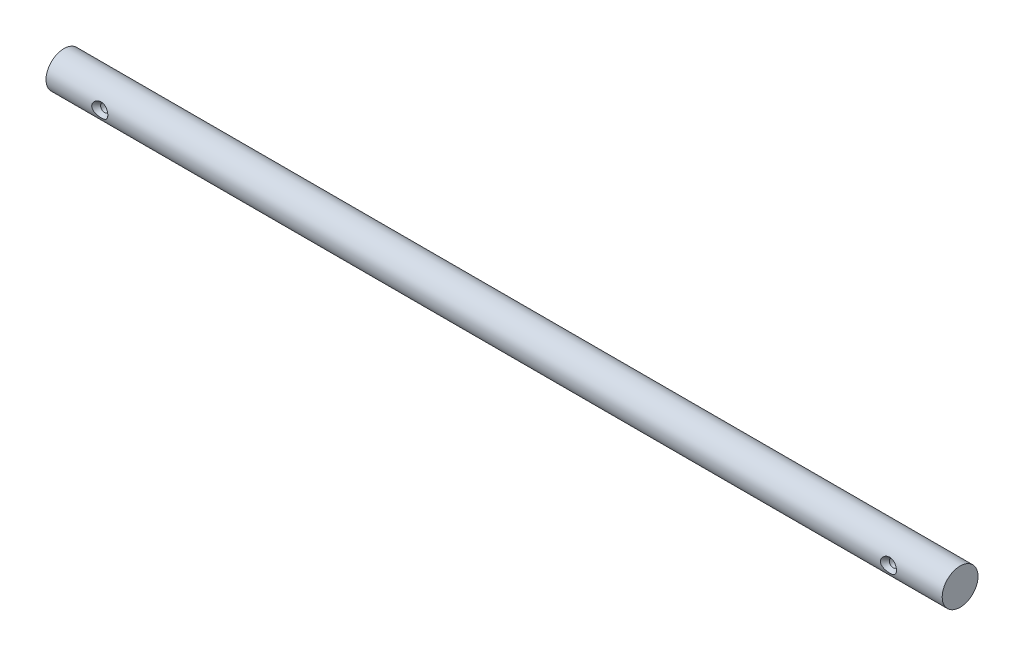
ISO-10303-21;
HEADER;
FILE_DESCRIPTION(('STEP AP214'),'2;1');
FILE_NAME('part.step','',(''),(''),'','','');
FILE_SCHEMA(('AUTOMOTIVE_DESIGN { 1 0 10303 214 1 1 1 1 }'));
ENDSEC;
DATA;
#1=APPLICATION_CONTEXT('core data for automotive mechanical design processes');
#2=APPLICATION_PROTOCOL_DEFINITION('international standard','automotive_design',2000,#1);
#3=PRODUCT_CONTEXT('',#1,'mechanical');
#4=PRODUCT('Part','Part','',(#3));
#5=PRODUCT_RELATED_PRODUCT_CATEGORY('part','',(#4));
#6=PRODUCT_DEFINITION_FORMATION('','',#4);
#7=PRODUCT_DEFINITION_CONTEXT('part definition',#1,'design');
#8=PRODUCT_DEFINITION('design','',#6,#7);
#9=PRODUCT_DEFINITION_SHAPE('','',#8);
#10=(LENGTH_UNIT() NAMED_UNIT(*) SI_UNIT(.MILLI.,.METRE.));
#11=(NAMED_UNIT(*) PLANE_ANGLE_UNIT() SI_UNIT($,.RADIAN.));
#12=(NAMED_UNIT(*) SI_UNIT($,.STERADIAN.) SOLID_ANGLE_UNIT());
#13=UNCERTAINTY_MEASURE_WITH_UNIT(LENGTH_MEASURE(1.E-05),#10,'distance_accuracy_value','');
#14=(GEOMETRIC_REPRESENTATION_CONTEXT(3) GLOBAL_UNCERTAINTY_ASSIGNED_CONTEXT((#13)) GLOBAL_UNIT_ASSIGNED_CONTEXT((#10,
#11,#12)) REPRESENTATION_CONTEXT('',''));
#15=CARTESIAN_POINT('',(0.,0.,0.));
#16=DIRECTION('',(0.,0.,1.));
#17=DIRECTION('',(1.,0.,0.));
#18=AXIS2_PLACEMENT_3D('',#15,#16,#17);
#19=CARTESIAN_POINT('',(0.,6.35,0.));
#20=DIRECTION('',(1.,0.,0.));
#21=DIRECTION('',(0.,0.,-1.));
#22=AXIS2_PLACEMENT_3D('',#19,#20,#21);
#23=PLANE('',#22);
#24=CARTESIAN_POINT('',(0.,0.,0.));
#25=DIRECTION('',(-1.,0.,0.));
#26=DIRECTION('',(0.,0.,1.));
#27=AXIS2_PLACEMENT_3D('',#24,#25,#26);
#28=CIRCLE('',#27,6.35);
#29=CARTESIAN_POINT('',(0.,0.,6.35));
#30=VERTEX_POINT('',#29);
#31=EDGE_CURVE('E97',#30,#30,#28,.T.);
#32=ORIENTED_EDGE('',*,*,#31,.T.);
#33=EDGE_LOOP('',(#32));
#34=FACE_BOUND('',#33,.T.);
#35=ADVANCED_FACE('F42',(#34),#23,.F.);
#36=CARTESIAN_POINT('',(317.5,0.,0.));
#37=DIRECTION('',(-1.,0.,0.));
#38=DIRECTION('',(0.,0.,1.));
#39=AXIS2_PLACEMENT_3D('',#36,#37,#38);
#40=PLANE('',#39);
#41=CARTESIAN_POINT('',(317.5,0.,0.));
#42=DIRECTION('',(-1.,0.,0.));
#43=DIRECTION('',(0.,0.,1.));
#44=AXIS2_PLACEMENT_3D('',#41,#42,#43);
#45=CIRCLE('',#44,6.35);
#46=CARTESIAN_POINT('',(317.5,0.,6.35));
#47=VERTEX_POINT('',#46);
#48=EDGE_CURVE('E94',#47,#47,#45,.T.);
#49=ORIENTED_EDGE('',*,*,#48,.F.);
#50=EDGE_LOOP('',(#49));
#51=FACE_BOUND('',#50,.T.);
#52=ADVANCED_FACE('F116',(#51),#40,.F.);
#53=CARTESIAN_POINT('',(0.,0.,0.));
#54=DIRECTION('',(-1.,0.,0.));
#55=DIRECTION('',(0.,0.,1.));
#56=AXIS2_PLACEMENT_3D('',#53,#54,#55);
#57=CYLINDRICAL_SURFACE('',#56,6.35);
#58=CARTESIAN_POINT('',(20.4390625,0.,-6.35));
#59=CARTESIAN_POINT('',(20.4390598693034,0.077040847168283,-6.34999857899858));
#60=CARTESIAN_POINT('',(20.4326315480876,0.154113483155262,-6.34858371582944));
#61=CARTESIAN_POINT('',(20.4071148143666,0.306069518531248,-6.3430762080525));
#62=CARTESIAN_POINT('',(20.3880173565476,0.380951313826296,-6.33898165026606));
#63=CARTESIAN_POINT('',(20.3377891374239,0.526307623730004,-6.32857064766496));
#64=CARTESIAN_POINT('',(20.3066709469655,0.596786653438424,-6.32225652460999));
#65=CARTESIAN_POINT('',(20.2333244870091,0.73152084022531,-6.30808785716228));
#66=CARTESIAN_POINT('',(20.1910965046489,0.795776158099904,-6.30023335258277));
#67=CARTESIAN_POINT('',(20.0960119171915,0.917272723348733,-6.28370341003478));
#68=CARTESIAN_POINT('',(20.043011163738,0.974399782936219,-6.27501778865132));
#69=CARTESIAN_POINT('',(19.9281949885077,1.07902809540525,-6.25787628862363));
#70=CARTESIAN_POINT('',(19.8663787814889,1.12652848987194,-6.24942043052567));
#71=CARTESIAN_POINT('',(19.7348421298178,1.21105894182183,-6.23359544573771));
#72=CARTESIAN_POINT('',(19.6650418522263,1.24796743339354,-6.22623936751426));
#73=CARTESIAN_POINT('',(19.5200422066535,1.30948659380819,-6.21359298291537));
#74=CARTESIAN_POINT('',(19.44484348561,1.33409873341495,-6.20830242949951));
#75=CARTESIAN_POINT('',(19.292420223313,1.36994915689751,-6.20048981569181));
#76=CARTESIAN_POINT('',(19.2152454219172,1.38138961213298,-6.19792595162784));
#77=CARTESIAN_POINT('',(19.0600325548733,1.39120053912365,-6.19573145355588));
#78=CARTESIAN_POINT('',(18.9819945965354,1.3895726177385,-6.19610045892848));
#79=CARTESIAN_POINT('',(18.8287736715116,1.37345569747506,-6.19969216119694));
#80=CARTESIAN_POINT('',(18.7535645930165,1.35920156493734,-6.20286274198083));
#81=CARTESIAN_POINT('',(18.6066317978724,1.31860894659745,-6.21161795094662));
#82=CARTESIAN_POINT('',(18.5349082770534,1.29226978268468,-6.21720271459119));
#83=CARTESIAN_POINT('',(18.3963223209075,1.22803912268215,-6.23020838169099));
#84=CARTESIAN_POINT('',(18.3295031345282,1.19005732002183,-6.23764354992541));
#85=CARTESIAN_POINT('',(18.2030997711631,1.10368304558917,-6.25350352055306));
#86=CARTESIAN_POINT('',(18.1435165823363,1.05528915442124,-6.26192845780233));
#87=CARTESIAN_POINT('',(18.0319243751887,0.948221191319585,-6.27904229219529));
#88=CARTESIAN_POINT('',(17.9801070541177,0.889347407317588,-6.28773295721028));
#89=CARTESIAN_POINT('',(17.887050075938,0.763647218737208,-6.30423308338503));
#90=CARTESIAN_POINT('',(17.8458106105133,0.696820670076994,-6.31204252857457));
#91=CARTESIAN_POINT('',(17.7750325873793,0.556877893735649,-6.32592565886695));
#92=CARTESIAN_POINT('',(17.7455191538667,0.483748565062285,-6.33199560926044));
#93=CARTESIAN_POINT('',(17.6992527118445,0.333406298546855,-6.3416880672381));
#94=CARTESIAN_POINT('',(17.6824978473559,0.256193956405845,-6.34531093078939));
#95=CARTESIAN_POINT('',(17.6625029862832,0.101521759768156,-6.34965034804132));
#96=CARTESIAN_POINT('',(17.6590011288717,0.0240972914376614,-6.35042320588568));
#97=CARTESIAN_POINT('',(17.6649019189039,-0.130230356866131,-6.34913331284916));
#98=CARTESIAN_POINT('',(17.6743036908942,-0.207133571848407,-6.34707075433855));
#99=CARTESIAN_POINT('',(17.7055277277516,-0.357368057618586,-6.34037731419124));
#100=CARTESIAN_POINT('',(17.7272126419359,-0.430729253025147,-6.33577484832666));
#101=CARTESIAN_POINT('',(17.7822349508315,-0.57277298475952,-6.32451674628277));
#102=CARTESIAN_POINT('',(17.8155733384149,-0.641455121837125,-6.31786093516479));
#103=CARTESIAN_POINT('',(17.8935018158413,-0.773273856447653,-6.30309556357787));
#104=CARTESIAN_POINT('',(17.9382457334331,-0.836317293289699,-6.29496660673028));
#105=CARTESIAN_POINT('',(18.0375125908739,-0.954094899266629,-6.27819624848666));
#106=CARTESIAN_POINT('',(18.0920368010628,-1.00882798728205,-6.26955478061946));
#107=CARTESIAN_POINT('',(18.2105181122511,-1.10946652714324,-6.2525388718201));
#108=CARTESIAN_POINT('',(18.2746305695929,-1.15519065365342,-6.24417228961642));
#109=CARTESIAN_POINT('',(18.4097783780868,-1.23522363853577,-6.22883534751375));
#110=CARTESIAN_POINT('',(18.4808134295235,-1.26953299083003,-6.22186492720744));
#111=CARTESIAN_POINT('',(18.6274091155417,-1.3255308249353,-6.21017608603567));
#112=CARTESIAN_POINT('',(18.7029415872971,-1.34729026638092,-6.2054450311924));
#113=CARTESIAN_POINT('',(18.8567075911832,-1.3777784494499,-6.19874782905592));
#114=CARTESIAN_POINT('',(18.9349406892354,-1.38650927531006,-6.19678123952368));
#115=CARTESIAN_POINT('',(19.0900589152149,-1.39060367444849,-6.19586350318036));
#116=CARTESIAN_POINT('',(19.1669362101337,-1.38625475155461,-6.1968474986074));
#117=CARTESIAN_POINT('',(19.3188340945831,-1.36495585245806,-6.20157337782062));
#118=CARTESIAN_POINT('',(19.3938547059915,-1.34800602480796,-6.20531522909432));
#119=CARTESIAN_POINT('',(19.5396812276129,-1.30212537285486,-6.21510358904485));
#120=CARTESIAN_POINT('',(19.6105008812921,-1.2732363980058,-6.22114204176945));
#121=CARTESIAN_POINT('',(19.7463309126718,-1.20433345118798,-6.23484638338867));
#122=CARTESIAN_POINT('',(19.8113406840637,-1.16431831990123,-6.24251244185608));
#123=CARTESIAN_POINT('',(19.9351228078034,-1.07334538224576,-6.25880195994543));
#124=CARTESIAN_POINT('',(19.9937424725145,-1.02218268785289,-6.2674416430782));
#125=CARTESIAN_POINT('',(20.1016586209977,-0.910782131259332,-6.28459592080665));
#126=CARTESIAN_POINT('',(20.1509529464271,-0.8505421739148,-6.29311048602432));
#127=CARTESIAN_POINT('',(20.239431465789,-0.721755121796875,-6.30918620130407));
#128=CARTESIAN_POINT('',(20.2784761694948,-0.653110375924708,-6.31673354607912));
#129=CARTESIAN_POINT('',(20.3444115434239,-0.510081834303289,-6.3298859198831));
#130=CARTESIAN_POINT('',(20.3713124050221,-0.435702912410395,-6.3354925766542));
#131=CARTESIAN_POINT('',(20.4074030162648,-0.301041738185884,-6.34313167188264));
#132=CARTESIAN_POINT('',(20.4192526660688,-0.241487886914346,-6.34569133939321));
#133=CARTESIAN_POINT('',(20.43508326917,-0.121295893746684,-6.34912602552347));
#134=CARTESIAN_POINT('',(20.4390645712684,-0.0606578000349112,-6.35000111881973));
#135=CARTESIAN_POINT('',(20.4390625,0.,-6.35));
#136=B_SPLINE_CURVE_WITH_KNOTS('',3,(#58,#59,#60,#61,#62,#63,#64,#65,#66,#67,#68,#69,#70,#71,
#72,#73,#74,#75,#76,#77,#78,#79,#80,#81,#82,#83,#84,#85,#86,#87,#88,#89,#90,#91,#92,#93,#94,#95,
#96,#97,#98,#99,#100,#101,#102,#103,#104,#105,#106,#107,#108,#109,#110,#111,#112,#113,#114,#115,
#116,#117,#118,#119,#120,#121,#122,#123,#124,#125,#126,#127,#128,#129,#130,#131,#132,#133,#134,
#135),.UNSPECIFIED.,.T.,.F.,(4,2,2,2,2,2,2,2,2,2,2,2,2,2,2,2,2,2,2,2,2,2,2,2,2,2,2,2,2,2,2,2,2,
2,2,2,2,2,4),(0.,0.230900509144249,0.4619660507311,0.69279060367213,0.923609191426884,
1.15774795204596,1.39190758176553,1.62865607320934,1.86537624043712,2.09841242042368,
2.33141994721875,2.56018212935158,2.78895714926963,3.01955360668713,3.25018151938972,
3.48579772155466,3.72141819307559,3.95754081719481,4.19362908617659,4.42502746626468,
4.65641014778621,4.8852551759393,5.11411970636798,5.34625135018098,5.57841316690403,
5.81485460555445,6.05128581195315,6.28636674309187,6.52141006341359,6.75132496959777,
6.98123716534876,7.21035021078303,7.43948713818204,7.67325690109677,7.90708070382926,
8.14393862784678,8.38059740434397,8.56240404777389,8.74420263159576),.UNSPECIFIED.);
#137=CARTESIAN_POINT('',(20.4390625,0.,-6.35));
#138=VERTEX_POINT('',#137);
#139=EDGE_CURVE('E12',#138,#138,#136,.T.);
#140=ORIENTED_EDGE('',*,*,#139,.T.);
#141=EDGE_LOOP('',(#140));
#142=FACE_BOUND('',#141,.T.);
#143=CARTESIAN_POINT('',(17.152161590775,-1.81624904761489,6.084713600142));
#144=CARTESIAN_POINT('',(17.0470913970432,-1.73641863133223,6.10854238130285));
#145=CARTESIAN_POINT('',(16.9477233701965,-1.64916128464033,6.13288354447783));
#146=CARTESIAN_POINT('',(16.7631847832379,-1.46036933370756,6.18055705233761));
#147=CARTESIAN_POINT('',(16.6780158425454,-1.35883310337751,6.2038892817281));
#148=CARTESIAN_POINT('',(16.5311676213008,-1.15110633676338,6.24561997135586));
#149=CARTESIAN_POINT('',(16.4681714492155,-1.04590236066532,6.264261674749));
#150=CARTESIAN_POINT('',(16.3598997606264,-0.826055407604052,6.29701907805596));
#151=CARTESIAN_POINT('',(16.3146136844096,-0.711418104810286,6.31113747409862));
#152=CARTESIAN_POINT('',(16.2441714671321,-0.474721226458277,6.33335040302032));
#153=CARTESIAN_POINT('',(16.219137070189,-0.352621439072377,6.34140848391411));
#154=CARTESIAN_POINT('',(16.1914799483112,-0.105654688246346,6.3503204380731));
#155=CARTESIAN_POINT('',(16.188846290967,0.0192108955443182,6.3511778255469));
#156=CARTESIAN_POINT('',(16.2052598590212,0.254492299055701,6.34587841600544));
#157=CARTESIAN_POINT('',(16.2221264390044,0.365084664543203,6.34042704444722));
#158=CARTESIAN_POINT('',(16.2730248428917,0.581812634683283,6.32422397749841));
#159=CARTESIAN_POINT('',(16.3070585613147,0.687947746044684,6.31347169711683));
#160=CARTESIAN_POINT('',(16.3914050613609,0.895523765166403,6.28742602776374));
#161=CARTESIAN_POINT('',(16.4420458142251,0.996818598218102,6.27204170889289));
#162=CARTESIAN_POINT('',(16.5571800707934,1.19059082243912,6.23816372670015));
#163=CARTESIAN_POINT('',(16.6216789328766,1.28306478290047,6.21966886125632));
#164=CARTESIAN_POINT('',(16.7725408890167,1.47080962463758,6.17816742091816));
#165=CARTESIAN_POINT('',(16.8607154018042,1.5645626856627,6.15489477345363));
#166=CARTESIAN_POINT('',(17.0495675093808,1.73839506906898,6.1080767297821));
#167=CARTESIAN_POINT('',(17.150253309944,1.81846533468914,6.0845311638519));
#168=CARTESIAN_POINT('',(17.3804081005201,1.97735376215491,6.03495496209966));
#169=CARTESIAN_POINT('',(17.5118207310697,2.05345654490567,6.00921921153121));
#170=CARTESIAN_POINT('',(17.78519749627,2.18550880777642,5.96246290708394));
#171=CARTESIAN_POINT('',(17.9271668410687,2.24144825579819,5.94144470233727));
#172=CARTESIAN_POINT('',(18.2343413528496,2.33759321674218,5.90433153410302));
#173=CARTESIAN_POINT('',(18.4003930334526,2.37542109625561,5.88902224662964));
#174=CARTESIAN_POINT('',(18.7369523755658,2.42497655553204,5.86879142704037));
#175=CARTESIAN_POINT('',(18.9074600455297,2.43670408577491,5.86386991463317));
#176=CARTESIAN_POINT('',(19.250528125794,2.43382018273977,5.86506837880858));
#177=CARTESIAN_POINT('',(19.4230851849789,2.41885116063058,5.87133826023836));
#178=CARTESIAN_POINT('',(19.7630436598001,2.36216297437399,5.8943705511642));
#179=CARTESIAN_POINT('',(19.9304441853853,2.32043921900233,5.91113476151933));
#180=CARTESIAN_POINT('',(20.2554382110777,2.21088886568108,5.95297353955144));
#181=CARTESIAN_POINT('',(20.4130286015583,2.14305403947139,5.97805072651192));
#182=CARTESIAN_POINT('',(20.7138663478462,1.98196041751918,6.03337115852242));
#183=CARTESIAN_POINT('',(20.8571035038224,1.88868371478641,6.06361803658402));
#184=CARTESIAN_POINT('',(21.1218540601265,1.67928633834519,6.12488444308719));
#185=CARTESIAN_POINT('',(21.2436807662236,1.56355866120538,6.15588362190003));
#186=CARTESIAN_POINT('',(21.4622443071463,1.30984652728888,6.2147890906659));
#187=CARTESIAN_POINT('',(21.5590440502754,1.17191931762838,6.24270303248477));
#188=CARTESIAN_POINT('',(21.6958858769574,0.922463310870232,6.28349465503456));
#189=CARTESIAN_POINT('',(21.7442313043528,0.815784507971373,6.29835922347488));
#190=CARTESIAN_POINT('',(21.823187634237,0.595491248085886,6.32298384369647));
#191=CARTESIAN_POINT('',(21.8538141887598,0.481883010625602,6.33274839984935));
#192=CARTESIAN_POINT('',(21.8955810445524,0.25026145067984,6.34613028155786));
#193=CARTESIAN_POINT('',(21.9066410613568,0.132231998928068,6.34972227845047));
#194=CARTESIAN_POINT('',(21.9082618515,-0.103988999023456,6.35024631732045));
#195=CARTESIAN_POINT('',(21.8988233931431,-0.222180538982039,6.34717860891052));
#196=CARTESIAN_POINT('',(21.8613756125757,-0.447316309348878,6.33516450135173));
#197=CARTESIAN_POINT('',(21.8346084903625,-0.554493243743241,6.32661166138011));
#198=CARTESIAN_POINT('',(21.7652077142336,-0.763045241354935,6.30486063389307));
#199=CARTESIAN_POINT('',(21.722570947201,-0.864419161701618,6.29166153495783));
#200=CARTESIAN_POINT('',(21.6201743872265,-1.06573753225701,6.26080979632639));
#201=CARTESIAN_POINT('',(21.5594924577202,-1.16517415266498,6.24292597956573));
#202=CARTESIAN_POINT('',(21.4247562435901,-1.35397100249534,6.204720693811));
#203=CARTESIAN_POINT('',(21.3506955509549,-1.44332636984771,6.18439805827127));
#204=CARTESIAN_POINT('',(21.1783745414429,-1.62489921298687,6.13940790592198));
#205=CARTESIAN_POINT('',(21.0781373941388,-1.71519752051362,6.11457313580695));
#206=CARTESIAN_POINT('',(20.8655205912984,-1.88043231485902,6.06579820931791));
#207=CARTESIAN_POINT('',(20.7531326358411,-1.95535819861761,6.04185867967687));
#208=CARTESIAN_POINT('',(20.4991864923299,-2.1005884119699,5.9930672446069));
#209=CARTESIAN_POINT('',(20.3558893261932,-2.16803821431716,5.96872897840509));
#210=CARTESIAN_POINT('',(20.059931791495,-2.28078206395932,5.926564130017));
#211=CARTESIAN_POINT('',(19.9072688557943,-2.32607000592167,5.90873934255984));
#212=CARTESIAN_POINT('',(19.5840682431807,-2.39656625364769,5.88052357011278));
#213=CARTESIAN_POINT('',(19.4130646148689,-2.4199352102291,5.87081996676305));
#214=CARTESIAN_POINT('',(19.0691930606116,-2.43980929907082,5.86258888597738));
#215=CARTESIAN_POINT('',(18.8963246148248,-2.43630673663342,5.86406460975615));
#216=CARTESIAN_POINT('',(18.5535222571889,-2.40248903043812,5.87799890157269));
#217=CARTESIAN_POINT('',(18.3835915388802,-2.37214637467634,5.89046873890573));
#218=CARTESIAN_POINT('',(18.0517005378701,-2.2851541993707,5.9247566668338));
#219=CARTESIAN_POINT('',(17.8897329106809,-2.22852944345963,5.94656595607708));
#220=CARTESIAN_POINT('',(17.630654210119,-2.11312280299925,5.98828654792114));
#221=CARTESIAN_POINT('',(17.530020402753,-2.06144339082412,6.00637816123887));
#222=CARTESIAN_POINT('',(17.3355956760734,-1.94705949357561,6.04442698369964));
#223=CARTESIAN_POINT('',(17.2418033765497,-1.88435724100966,6.06438381468881));
#224=CARTESIAN_POINT('',(17.152161590775,-1.81624904761489,6.084713600142));
#225=B_SPLINE_CURVE_WITH_KNOTS('',3,(#143,#144,#145,#146,#147,#148,#149,#150,#151,#152,#153,
#154,#155,#156,#157,#158,#159,#160,#161,#162,#163,#164,#165,#166,#167,#168,#169,#170,#171,#172,
#173,#174,#175,#176,#177,#178,#179,#180,#181,#182,#183,#184,#185,#186,#187,#188,#189,#190,#191,
#192,#193,#194,#195,#196,#197,#198,#199,#200,#201,#202,#203,#204,#205,#206,#207,#208,#209,#210,
#211,#212,#213,#214,#215,#216,#217,#218,#219,#220,#221,#222,#223,#224),.UNSPECIFIED.,.T.,.F.,(4,
2,2,2,2,2,2,2,2,2,2,2,2,2,2,2,2,2,2,2,2,2,2,2,2,2,2,2,2,2,2,2,2,2,2,2,2,2,2,2,4),(0.,
0.401980012324468,0.804005839538673,1.17456046628694,1.54489381031173,1.91743722686296,
2.28979881767528,2.62423947402786,2.95871704642414,3.30024387452269,3.64190299586299,
4.03280453871651,4.42396382881973,4.88416291712005,5.34459065859219,5.85517234273588,
6.36575499560385,6.88322812914981,7.40079008702562,7.91851527549046,8.43660580376524,
8.94633442438749,9.45476904236556,9.80750917712849,10.1599372399065,10.5138080435003,
10.867665583876,11.1986078944681,11.5296151596019,11.8818325223864,12.2342190357995,
12.6442000567112,13.054462916496,13.5331444063368,14.0119576931778,14.5280761765437,
15.0443424566868,15.5611385412552,16.0774486734308,16.4204717148011,16.7634253619836),.UNSPECIFIED.);
#226=CARTESIAN_POINT('',(17.152161590775,-1.81624904761489,6.084713600142));
#227=VERTEX_POINT('',#226);
#228=EDGE_CURVE('E53',#227,#227,#225,.T.);
#229=ORIENTED_EDGE('',*,*,#228,.T.);
#230=EDGE_LOOP('',(#229));
#231=FACE_BOUND('',#230,.T.);
#232=CARTESIAN_POINT('',(299.8390625,0.,-6.35));
#233=CARTESIAN_POINT('',(299.839059869303,0.0770408471682809,-6.34999857899858));
#234=CARTESIAN_POINT('',(299.832631548088,0.154113483155258,-6.34858371582944));
#235=CARTESIAN_POINT('',(299.807114814367,0.306069518531241,-6.3430762080525));
#236=CARTESIAN_POINT('',(299.788017356548,0.380951313826289,-6.33898165026607));
#237=CARTESIAN_POINT('',(299.737789137424,0.526307623730006,-6.32857064766496));
#238=CARTESIAN_POINT('',(299.706670946966,0.596786653438434,-6.32225652460999));
#239=CARTESIAN_POINT('',(299.633324487009,0.731520840225318,-6.30808785716228));
#240=CARTESIAN_POINT('',(299.591096504649,0.795776158099905,-6.30023335258277));
#241=CARTESIAN_POINT('',(299.496011917191,0.917272723348728,-6.28370341003478));
#242=CARTESIAN_POINT('',(299.443011163738,0.974399782936214,-6.27501778865132));
#243=CARTESIAN_POINT('',(299.328194988508,1.07902809540524,-6.25787628862363));
#244=CARTESIAN_POINT('',(299.266378781489,1.12652848987193,-6.24942043052567));
#245=CARTESIAN_POINT('',(299.134842129818,1.21105894182182,-6.23359544573771));
#246=CARTESIAN_POINT('',(299.065041852226,1.24796743339354,-6.22623936751426));
#247=CARTESIAN_POINT('',(298.920042206653,1.30948659380819,-6.21359298291537));
#248=CARTESIAN_POINT('',(298.84484348561,1.33409873341495,-6.20830242949952));
#249=CARTESIAN_POINT('',(298.692420223313,1.3699491568975,-6.20048981569182));
#250=CARTESIAN_POINT('',(298.615245421917,1.38138961213297,-6.19792595162784));
#251=CARTESIAN_POINT('',(298.460032554873,1.39120053912364,-6.19573145355588));
#252=CARTESIAN_POINT('',(298.381994596535,1.38957261773848,-6.19610045892849));
#253=CARTESIAN_POINT('',(298.228773671512,1.37345569747505,-6.19969216119694));
#254=CARTESIAN_POINT('',(298.153564593017,1.35920156493734,-6.20286274198083));
#255=CARTESIAN_POINT('',(298.006631797872,1.31860894659745,-6.21161795094662));
#256=CARTESIAN_POINT('',(297.934908277053,1.29226978268468,-6.21720271459119));
#257=CARTESIAN_POINT('',(297.796322320908,1.22803912268215,-6.23020838169099));
#258=CARTESIAN_POINT('',(297.729503134528,1.19005732002185,-6.23764354992541));
#259=CARTESIAN_POINT('',(297.603099771163,1.1036830455892,-6.25350352055306));
#260=CARTESIAN_POINT('',(297.543516582336,1.05528915442127,-6.26192845780232));
#261=CARTESIAN_POINT('',(297.431924375189,0.948221191319613,-6.27904229219529));
#262=CARTESIAN_POINT('',(297.380107054118,0.889347407317614,-6.28773295721028));
#263=CARTESIAN_POINT('',(297.287050075938,0.763647218737223,-6.30423308338503));
#264=CARTESIAN_POINT('',(297.245810610513,0.696820670077003,-6.31204252857457));
#265=CARTESIAN_POINT('',(297.175032587379,0.556877893735655,-6.32592565886695));
#266=CARTESIAN_POINT('',(297.145519153867,0.483748565062295,-6.33199560926044));
#267=CARTESIAN_POINT('',(297.099252711844,0.333406298546867,-6.34168806723809));
#268=CARTESIAN_POINT('',(297.082497847356,0.256193956405854,-6.34531093078939));
#269=CARTESIAN_POINT('',(297.062502986283,0.101521759768165,-6.34965034804132));
#270=CARTESIAN_POINT('',(297.059001128872,0.0240972914376697,-6.35042320588568));
#271=CARTESIAN_POINT('',(297.064901918904,-0.130230356866122,-6.34913331284916));
#272=CARTESIAN_POINT('',(297.074303690894,-0.207133571848399,-6.34707075433855));
#273=CARTESIAN_POINT('',(297.105527727752,-0.357368057618584,-6.34037731419124));
#274=CARTESIAN_POINT('',(297.127212641936,-0.430729253025151,-6.33577484832666));
#275=CARTESIAN_POINT('',(297.182234950832,-0.572772984759522,-6.32451674628277));
#276=CARTESIAN_POINT('',(297.215573338415,-0.64145512183712,-6.31786093516479));
#277=CARTESIAN_POINT('',(297.293501815841,-0.773273856447638,-6.30309556357787));
#278=CARTESIAN_POINT('',(297.338245733433,-0.836317293289683,-6.29496660673028));
#279=CARTESIAN_POINT('',(297.437512590874,-0.954094899266608,-6.27819624848666));
#280=CARTESIAN_POINT('',(297.492036801063,-1.00882798728202,-6.26955478061946));
#281=CARTESIAN_POINT('',(297.610518112251,-1.10946652714321,-6.25253887182011));
#282=CARTESIAN_POINT('',(297.674630569593,-1.15519065365341,-6.24417228961643));
#283=CARTESIAN_POINT('',(297.809778378087,-1.23522363853577,-6.22883534751375));
#284=CARTESIAN_POINT('',(297.880813429523,-1.26953299083002,-6.22186492720744));
#285=CARTESIAN_POINT('',(298.027409115542,-1.32553082493528,-6.21017608603567));
#286=CARTESIAN_POINT('',(298.102941587297,-1.3472902663809,-6.20544503119241));
#287=CARTESIAN_POINT('',(298.256707591183,-1.37777844944988,-6.19874782905593));
#288=CARTESIAN_POINT('',(298.334940689235,-1.38650927531004,-6.19678123952368));
#289=CARTESIAN_POINT('',(298.490058915215,-1.39060367444848,-6.19586350318037));
#290=CARTESIAN_POINT('',(298.566936210134,-1.38625475155459,-6.19684749860741));
#291=CARTESIAN_POINT('',(298.718834094583,-1.36495585245804,-6.20157337782063));
#292=CARTESIAN_POINT('',(298.793854705991,-1.34800602480795,-6.20531522909432));
#293=CARTESIAN_POINT('',(298.939681227613,-1.30212537285485,-6.21510358904485));
#294=CARTESIAN_POINT('',(299.010500881292,-1.27323639800578,-6.22114204176946));
#295=CARTESIAN_POINT('',(299.146330912672,-1.20433345118796,-6.23484638338867));
#296=CARTESIAN_POINT('',(299.211340684064,-1.16431831990122,-6.24251244185608));
#297=CARTESIAN_POINT('',(299.335122807803,-1.07334538224576,-6.25880195994544));
#298=CARTESIAN_POINT('',(299.393742472514,-1.02218268785288,-6.2674416430782));
#299=CARTESIAN_POINT('',(299.501658620998,-0.910782131259316,-6.28459592080665));
#300=CARTESIAN_POINT('',(299.550952946427,-0.850542173914781,-6.29311048602432));
#301=CARTESIAN_POINT('',(299.639431465789,-0.72175512179687,-6.30918620130407));
#302=CARTESIAN_POINT('',(299.678476169495,-0.653110375924721,-6.31673354607911));
#303=CARTESIAN_POINT('',(299.744411543424,-0.510081834303301,-6.3298859198831));
#304=CARTESIAN_POINT('',(299.771312405022,-0.435702912410385,-6.3354925766542));
#305=CARTESIAN_POINT('',(299.807403016265,-0.301041738185858,-6.34313167188265));
#306=CARTESIAN_POINT('',(299.819252666069,-0.241487886914325,-6.34569133939321));
#307=CARTESIAN_POINT('',(299.83508326917,-0.121295893746672,-6.34912602552347));
#308=CARTESIAN_POINT('',(299.839064571268,-0.0606578000349053,-6.35000111881973));
#309=CARTESIAN_POINT('',(299.8390625,0.,-6.35));
#310=B_SPLINE_CURVE_WITH_KNOTS('',3,(#232,#233,#234,#235,#236,#237,#238,#239,#240,#241,#242,
#243,#244,#245,#246,#247,#248,#249,#250,#251,#252,#253,#254,#255,#256,#257,#258,#259,#260,#261,
#262,#263,#264,#265,#266,#267,#268,#269,#270,#271,#272,#273,#274,#275,#276,#277,#278,#279,#280,
#281,#282,#283,#284,#285,#286,#287,#288,#289,#290,#291,#292,#293,#294,#295,#296,#297,#298,#299,
#300,#301,#302,#303,#304,#305,#306,#307,#308,#309),.UNSPECIFIED.,.T.,.F.,(4,2,2,2,2,2,2,2,2,2,2,
2,2,2,2,2,2,2,2,2,2,2,2,2,2,2,2,2,2,2,2,2,2,2,2,2,2,2,4),(0.,0.230900509144244,
0.461966050731088,0.692790603672155,0.923609191426892,1.15774795204596,1.3919075817655,
1.62865607320936,1.86537624043708,2.09841242042362,2.33141994721868,2.56018212935151,
2.78895714926953,3.01955360668701,3.25018151938963,3.4857977215546,3.7214181930755,
3.95754081719473,4.19362908617653,4.42502746626461,4.65641014778615,4.88525517593925,
5.11411970636792,5.34625135018088,5.57841316690395,5.81485460555438,6.05128581195307,
6.28636674309176,6.5214100634135,6.75132496959772,6.98123716534868,7.21035021078293,
7.4394871381819,7.67325690109663,7.90708070382916,8.14393862784662,8.38059740434387,
8.56240404777378,8.74420263159563),.UNSPECIFIED.);
#311=CARTESIAN_POINT('',(299.8390625,0.,-6.35));
#312=VERTEX_POINT('',#311);
#313=EDGE_CURVE('E57',#312,#312,#310,.T.);
#314=ORIENTED_EDGE('',*,*,#313,.T.);
#315=EDGE_LOOP('',(#314));
#316=FACE_BOUND('',#315,.T.);
#317=CARTESIAN_POINT('',(296.552161590775,-1.81624904761486,6.084713600142));
#318=CARTESIAN_POINT('',(296.447091397043,-1.73641863133221,6.10854238130285));
#319=CARTESIAN_POINT('',(296.347723370196,-1.6491612846403,6.13288354447784));
#320=CARTESIAN_POINT('',(296.163184783238,-1.46036933370752,6.18055705233762));
#321=CARTESIAN_POINT('',(296.078015842545,-1.35883310337746,6.20388928172811));
#322=CARTESIAN_POINT('',(295.931167621301,-1.15110633676333,6.24561997135587));
#323=CARTESIAN_POINT('',(295.868171449215,-1.04590236066528,6.264261674749));
#324=CARTESIAN_POINT('',(295.759899760626,-0.826055407604006,6.29701907805597));
#325=CARTESIAN_POINT('',(295.71461368441,-0.71141810481023,6.31113747409863));
#326=CARTESIAN_POINT('',(295.644171467132,-0.474721226458219,6.33335040302032));
#327=CARTESIAN_POINT('',(295.619137070189,-0.352621439072326,6.34140848391411));
#328=CARTESIAN_POINT('',(295.591479948311,-0.105654688246305,6.3503204380731));
#329=CARTESIAN_POINT('',(295.588846290967,0.0192108955443598,6.3511778255469));
#330=CARTESIAN_POINT('',(295.605259859021,0.254492299055736,6.34587841600544));
#331=CARTESIAN_POINT('',(295.622126439004,0.365084664543232,6.34042704444721));
#332=CARTESIAN_POINT('',(295.673024842892,0.581812634683311,6.32422397749841));
#333=CARTESIAN_POINT('',(295.707058561315,0.687947746044717,6.31347169711683));
#334=CARTESIAN_POINT('',(295.791405061361,0.895523765166439,6.28742602776373));
#335=CARTESIAN_POINT('',(295.842045814225,0.996818598218137,6.27204170889289));
#336=CARTESIAN_POINT('',(295.957180070793,1.19059082243915,6.23816372670014));
#337=CARTESIAN_POINT('',(296.021678932877,1.28306478290049,6.21966886125631));
#338=CARTESIAN_POINT('',(296.172540889017,1.4708096246376,6.17816742091815));
#339=CARTESIAN_POINT('',(296.260715401804,1.56456268566273,6.15489477345363));
#340=CARTESIAN_POINT('',(296.449567509381,1.73839506906901,6.10807672978209));
#341=CARTESIAN_POINT('',(296.550253309944,1.81846533468917,6.08453116385189));
#342=CARTESIAN_POINT('',(296.78040810052,1.97735376215494,6.03495496209966));
#343=CARTESIAN_POINT('',(296.91182073107,2.0534565449057,6.0092192115312));
#344=CARTESIAN_POINT('',(297.18519749627,2.18550880777645,5.96246290708393));
#345=CARTESIAN_POINT('',(297.327166841069,2.24144825579822,5.94144470233725));
#346=CARTESIAN_POINT('',(297.63434135285,2.3375932167422,5.90433153410302));
#347=CARTESIAN_POINT('',(297.800393033453,2.37542109625563,5.88902224662963));
#348=CARTESIAN_POINT('',(298.136952375566,2.42497655553205,5.86879142704036));
#349=CARTESIAN_POINT('',(298.30746004553,2.43670408577492,5.86386991463317));
#350=CARTESIAN_POINT('',(298.650528125794,2.43382018273978,5.86506837880858));
#351=CARTESIAN_POINT('',(298.823085184979,2.41885116063058,5.87133826023836));
#352=CARTESIAN_POINT('',(299.1630436598,2.36216297437399,5.8943705511642));
#353=CARTESIAN_POINT('',(299.330444185385,2.32043921900233,5.91113476151933));
#354=CARTESIAN_POINT('',(299.655438211078,2.21088886568108,5.95297353955145));
#355=CARTESIAN_POINT('',(299.813028601558,2.14305403947138,5.97805072651193));
#356=CARTESIAN_POINT('',(300.113866347846,1.98196041751914,6.03337115852243));
#357=CARTESIAN_POINT('',(300.257103503822,1.88868371478636,6.06361803658404));
#358=CARTESIAN_POINT('',(300.521854060127,1.67928633834513,6.1248844430872));
#359=CARTESIAN_POINT('',(300.643680766224,1.56355866120534,6.15588362190004));
#360=CARTESIAN_POINT('',(300.862244307146,1.30984652728885,6.21478909066591));
#361=CARTESIAN_POINT('',(300.959044050275,1.17191931762834,6.24270303248478));
#362=CARTESIAN_POINT('',(301.095885876957,0.92246331087021,6.28349465503456));
#363=CARTESIAN_POINT('',(301.144231304353,0.815784507971354,6.29835922347489));
#364=CARTESIAN_POINT('',(301.223187634237,0.59549124808587,6.32298384369647));
#365=CARTESIAN_POINT('',(301.25381418876,0.481883010625587,6.33274839984935));
#366=CARTESIAN_POINT('',(301.295581044552,0.250261450679824,6.34613028155786));
#367=CARTESIAN_POINT('',(301.306641061357,0.132231998928051,6.34972227845047));
#368=CARTESIAN_POINT('',(301.3082618515,-0.103988999023474,6.35024631732044));
#369=CARTESIAN_POINT('',(301.298823393143,-0.222180538982057,6.34717860891052));
#370=CARTESIAN_POINT('',(301.261375612576,-0.447316309348896,6.33516450135173));
#371=CARTESIAN_POINT('',(301.234608490363,-0.554493243743259,6.32661166138011));
#372=CARTESIAN_POINT('',(301.165207714234,-0.763045241354951,6.30486063389307));
#373=CARTESIAN_POINT('',(301.122570947201,-0.864419161701632,6.29166153495782));
#374=CARTESIAN_POINT('',(301.020174387227,-1.06573753225702,6.26080979632639));
#375=CARTESIAN_POINT('',(300.95949245772,-1.16517415266499,6.24292597956573));
#376=CARTESIAN_POINT('',(300.82475624359,-1.35397100249534,6.204720693811));
#377=CARTESIAN_POINT('',(300.750695550955,-1.44332636984771,6.18439805827127));
#378=CARTESIAN_POINT('',(300.578374541443,-1.62489921298688,6.13940790592197));
#379=CARTESIAN_POINT('',(300.478137394139,-1.71519752051364,6.11457313580694));
#380=CARTESIAN_POINT('',(300.265520591298,-1.88043231485904,6.0657982093179));
#381=CARTESIAN_POINT('',(300.153132635841,-1.95535819861764,6.04185867967686));
#382=CARTESIAN_POINT('',(299.89918649233,-2.10058841196992,5.99306724460689));
#383=CARTESIAN_POINT('',(299.755889326193,-2.16803821431718,5.96872897840508));
#384=CARTESIAN_POINT('',(299.459931791495,-2.28078206395933,5.926564130017));
#385=CARTESIAN_POINT('',(299.307268855794,-2.32607000592168,5.90873934255984));
#386=CARTESIAN_POINT('',(298.984068243181,-2.39656625364769,5.88052357011278));
#387=CARTESIAN_POINT('',(298.813064614869,-2.4199352102291,5.87081996676305));
#388=CARTESIAN_POINT('',(298.469193060612,-2.43980929907082,5.86258888597738));
#389=CARTESIAN_POINT('',(298.296324614825,-2.43630673663343,5.86406460975614));
#390=CARTESIAN_POINT('',(297.953522257189,-2.40248903043812,5.87799890157269));
#391=CARTESIAN_POINT('',(297.78359153888,-2.37214637467634,5.89046873890573));
#392=CARTESIAN_POINT('',(297.45170053787,-2.2851541993707,5.9247566668338));
#393=CARTESIAN_POINT('',(297.289732910681,-2.22852944345963,5.94656595607707));
#394=CARTESIAN_POINT('',(297.030654210119,-2.11312280299925,5.98828654792114));
#395=CARTESIAN_POINT('',(296.930020402753,-2.06144339082411,6.00637816123888));
#396=CARTESIAN_POINT('',(296.735595676073,-1.94705949357559,6.04442698369964));
#397=CARTESIAN_POINT('',(296.64180337655,-1.88435724100964,6.06438381468881));
#398=CARTESIAN_POINT('',(296.552161590775,-1.81624904761486,6.084713600142));
#399=B_SPLINE_CURVE_WITH_KNOTS('',3,(#317,#318,#319,#320,#321,#322,#323,#324,#325,#326,#327,
#328,#329,#330,#331,#332,#333,#334,#335,#336,#337,#338,#339,#340,#341,#342,#343,#344,#345,#346,
#347,#348,#349,#350,#351,#352,#353,#354,#355,#356,#357,#358,#359,#360,#361,#362,#363,#364,#365,
#366,#367,#368,#369,#370,#371,#372,#373,#374,#375,#376,#377,#378,#379,#380,#381,#382,#383,#384,
#385,#386,#387,#388,#389,#390,#391,#392,#393,#394,#395,#396,#397,#398),.UNSPECIFIED.,.T.,.F.,(4,
2,2,2,2,2,2,2,2,2,2,2,2,2,2,2,2,2,2,2,2,2,2,2,2,2,2,2,2,2,2,2,2,2,2,2,2,2,2,2,4),(0.,
0.401980012324445,0.804005839538673,1.17456046628695,1.54489381031172,1.91743722686295,
2.28979881767526,2.62423947402784,2.95871704642411,3.30024387452268,3.64190299586298,
4.0328045387165,4.42396382881975,4.88416291712004,5.34459065859222,5.85517234273589,
6.36575499560385,6.8832281291498,7.40079008702564,7.91851527549048,8.4366058037653,
8.94633442438753,9.45476904236556,9.8075091771285,10.1599372399065,10.5138080435003,
10.867665583876,11.1986078944681,11.5296151596019,11.8818325223864,12.2342190357995,
12.6442000567112,13.054462916496,13.5331444063369,14.0119576931778,14.5280761765437,
15.0443424566869,15.5611385412552,16.0774486734308,16.4204717148012,16.7634253619836),.UNSPECIFIED.);
#400=CARTESIAN_POINT('',(296.552161590775,-1.81624904761486,6.084713600142));
#401=VERTEX_POINT('',#400);
#402=EDGE_CURVE('E61',#401,#401,#399,.T.);
#403=ORIENTED_EDGE('',*,*,#402,.T.);
#404=EDGE_LOOP('',(#403));
#405=FACE_BOUND('',#404,.T.);
#406=ORIENTED_EDGE('',*,*,#31,.F.);
#407=EDGE_LOOP('',(#406));
#408=FACE_BOUND('',#407,.T.);
#409=ORIENTED_EDGE('',*,*,#48,.T.);
#410=EDGE_LOOP('',(#409));
#411=FACE_BOUND('',#410,.T.);
#412=ADVANCED_FACE('F72',(#142,#231,#316,#405,#408,#411),#57,.T.);
#413=CARTESIAN_POINT('',(298.45,0.,6.35));
#414=DIRECTION('',(0.,0.,1.));
#415=DIRECTION('',(1.,0.,0.));
#416=AXIS2_PLACEMENT_3D('',#413,#414,#415);
#417=CYLINDRICAL_SURFACE('',#416,1.38906249999998);
#418=CARTESIAN_POINT('',(298.45,0.,4.6607558920214));
#419=DIRECTION('',(0.,0.,1.));
#420=DIRECTION('',(1.,0.,0.));
#421=AXIS2_PLACEMENT_3D('',#418,#419,#420);
#422=CIRCLE('',#421,1.38906249999998);
#423=CARTESIAN_POINT('',(299.8390625,0.,4.6607558920214));
#424=VERTEX_POINT('',#423);
#425=EDGE_CURVE('E100',#424,#424,#422,.T.);
#426=ORIENTED_EDGE('',*,*,#425,.T.);
#427=EDGE_LOOP('',(#426));
#428=FACE_BOUND('',#427,.T.);
#429=ORIENTED_EDGE('',*,*,#313,.F.);
#430=EDGE_LOOP('',(#429));
#431=FACE_BOUND('',#430,.T.);
#432=ADVANCED_FACE('F86',(#428,#431),#417,.F.);
#433=CARTESIAN_POINT('',(298.45,0.,6.35));
#434=DIRECTION('',(0.,0.,1.));
#435=DIRECTION('',(1.,0.,0.));
#436=AXIS2_PLACEMENT_3D('',#433,#434,#435);
#437=CONICAL_SURFACE('',#436,2.85750000000001,0.715584993317685);
#438=ORIENTED_EDGE('',*,*,#425,.F.);
#439=EDGE_LOOP('',(#438));
#440=FACE_BOUND('',#439,.T.);
#441=ORIENTED_EDGE('',*,*,#402,.F.);
#442=EDGE_LOOP('',(#441));
#443=FACE_BOUND('',#442,.T.);
#444=ADVANCED_FACE('F82',(#440,#443),#437,.F.);
#445=CARTESIAN_POINT('',(19.05,0.,6.35));
#446=DIRECTION('',(0.,0.,1.));
#447=DIRECTION('',(1.,0.,0.));
#448=AXIS2_PLACEMENT_3D('',#445,#446,#447);
#449=CYLINDRICAL_SURFACE('',#448,1.3890625);
#450=CARTESIAN_POINT('',(19.05,0.,4.6607558920214));
#451=DIRECTION('',(0.,0.,1.));
#452=DIRECTION('',(1.,0.,0.));
#453=AXIS2_PLACEMENT_3D('',#450,#451,#452);
#454=CIRCLE('',#453,1.3890625);
#455=CARTESIAN_POINT('',(20.4390625,0.,4.6607558920214));
#456=VERTEX_POINT('',#455);
#457=EDGE_CURVE('E103',#456,#456,#454,.T.);
#458=ORIENTED_EDGE('',*,*,#457,.T.);
#459=EDGE_LOOP('',(#458));
#460=FACE_BOUND('',#459,.T.);
#461=ORIENTED_EDGE('',*,*,#139,.F.);
#462=EDGE_LOOP('',(#461));
#463=FACE_BOUND('',#462,.T.);
#464=ADVANCED_FACE('F77',(#460,#463),#449,.F.);
#465=CARTESIAN_POINT('',(19.05,0.,6.35));
#466=DIRECTION('',(0.,0.,1.));
#467=DIRECTION('',(1.,0.,0.));
#468=AXIS2_PLACEMENT_3D('',#465,#466,#467);
#469=CONICAL_SURFACE('',#468,2.8575,0.715584993317675);
#470=ORIENTED_EDGE('',*,*,#457,.F.);
#471=EDGE_LOOP('',(#470));
#472=FACE_BOUND('',#471,.T.);
#473=ORIENTED_EDGE('',*,*,#228,.F.);
#474=EDGE_LOOP('',(#473));
#475=FACE_BOUND('',#474,.T.);
#476=ADVANCED_FACE('F74',(#472,#475),#469,.F.);
#477=CLOSED_SHELL('',(#35,#52,#412,#432,#444,#464,#476));
#478=MANIFOLD_SOLID_BREP('B2',#477);
#479=ADVANCED_BREP_SHAPE_REPRESENTATION('',(#18,#478),#14);
#480=SHAPE_DEFINITION_REPRESENTATION(#9,#479);
ENDSEC;
END-ISO-10303-21;
